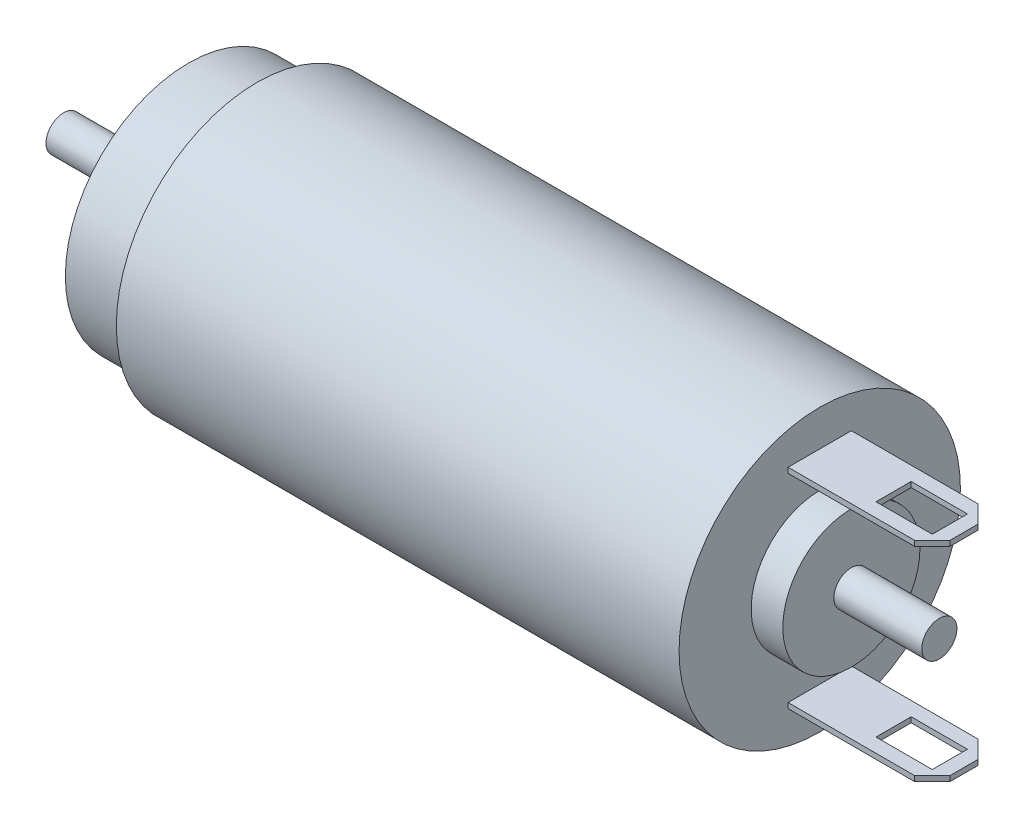
ISO-10303-21;
HEADER;
FILE_DESCRIPTION(('STEP AP214'),'2;1');
FILE_NAME('part.step','',(''),(''),'','','');
FILE_SCHEMA(('AUTOMOTIVE_DESIGN { 1 0 10303 214 1 1 1 1 }'));
ENDSEC;
DATA;
#1=APPLICATION_CONTEXT('core data for automotive mechanical design processes');
#2=APPLICATION_PROTOCOL_DEFINITION('international standard','automotive_design',2000,#1);
#3=PRODUCT_CONTEXT('',#1,'mechanical');
#4=PRODUCT('Part','Part','',(#3));
#5=PRODUCT_RELATED_PRODUCT_CATEGORY('part','',(#4));
#6=PRODUCT_DEFINITION_FORMATION('','',#4);
#7=PRODUCT_DEFINITION_CONTEXT('part definition',#1,'design');
#8=PRODUCT_DEFINITION('design','',#6,#7);
#9=PRODUCT_DEFINITION_SHAPE('','',#8);
#10=(LENGTH_UNIT() NAMED_UNIT(*) SI_UNIT(.MILLI.,.METRE.));
#11=(NAMED_UNIT(*) PLANE_ANGLE_UNIT() SI_UNIT($,.RADIAN.));
#12=(NAMED_UNIT(*) SI_UNIT($,.STERADIAN.) SOLID_ANGLE_UNIT());
#13=UNCERTAINTY_MEASURE_WITH_UNIT(LENGTH_MEASURE(1.E-05),#10,'distance_accuracy_value','');
#14=(GEOMETRIC_REPRESENTATION_CONTEXT(3) GLOBAL_UNCERTAINTY_ASSIGNED_CONTEXT((#13)) GLOBAL_UNIT_ASSIGNED_CONTEXT((#10,
#11,#12)) REPRESENTATION_CONTEXT('',''));
#15=CARTESIAN_POINT('',(0.,0.,0.));
#16=DIRECTION('',(0.,0.,1.));
#17=DIRECTION('',(1.,0.,0.));
#18=AXIS2_PLACEMENT_3D('',#15,#16,#17);
#19=CARTESIAN_POINT('',(0.,0.,0.));
#20=DIRECTION('',(1.,0.,0.));
#21=DIRECTION('',(0.,0.,-1.));
#22=AXIS2_PLACEMENT_3D('',#19,#20,#21);
#23=PLANE('',#22);
#24=CARTESIAN_POINT('',(0.,0.,0.));
#25=DIRECTION('',(1.,0.,0.));
#26=DIRECTION('',(0.,0.,-1.));
#27=AXIS2_PLACEMENT_3D('',#24,#25,#26);
#28=CIRCLE('',#27,1.95);
#29=CARTESIAN_POINT('',(0.,0.,-1.95));
#30=VERTEX_POINT('',#29);
#31=EDGE_CURVE('E349',#30,#30,#28,.T.);
#32=ORIENTED_EDGE('',*,*,#31,.F.);
#33=EDGE_LOOP('',(#32));
#34=FACE_BOUND('',#33,.T.);
#35=CARTESIAN_POINT('',(0.,0.,0.));
#36=DIRECTION('',(1.,0.,0.));
#37=DIRECTION('',(0.,0.,-1.));
#38=AXIS2_PLACEMENT_3D('',#35,#36,#37);
#39=CIRCLE('',#38,4.);
#40=CARTESIAN_POINT('',(0.,0.,-4.));
#41=VERTEX_POINT('',#40);
#42=EDGE_CURVE('E361',#41,#41,#39,.T.);
#43=ORIENTED_EDGE('',*,*,#42,.T.);
#44=EDGE_LOOP('',(#43));
#45=FACE_BOUND('',#44,.T.);
#46=DIRECTION('',(0.,0.,-1.));
#47=VECTOR('',#46,1.);
#48=CARTESIAN_POINT('',(0.,2.82169085468414,-0.899999999999999));
#49=LINE('',#48,#47);
#50=CARTESIAN_POINT('',(0.,2.82169085468414,0.900000000000001));
#51=VERTEX_POINT('',#50);
#52=CARTESIAN_POINT('',(0.,2.82169085468414,-0.899999999999999));
#53=VERTEX_POINT('',#52);
#54=EDGE_CURVE('E317',#51,#53,#49,.T.);
#55=ORIENTED_EDGE('',*,*,#54,.F.);
#56=DIRECTION('',(0.,-1.,0.));
#57=VECTOR('',#56,1.);
#58=CARTESIAN_POINT('',(0.,2.82169085468414,0.900000000000001));
#59=LINE('',#58,#57);
#60=CARTESIAN_POINT('',(0.,2.97169085468414,0.900000000000001));
#61=VERTEX_POINT('',#60);
#62=EDGE_CURVE('E303',#61,#51,#59,.T.);
#63=ORIENTED_EDGE('',*,*,#62,.F.);
#64=DIRECTION('',(0.,0.,1.));
#65=VECTOR('',#64,1.);
#66=CARTESIAN_POINT('',(0.,2.97169085468414,0.900000000000001));
#67=LINE('',#66,#65);
#68=CARTESIAN_POINT('',(0.,2.97169085468414,-0.899999999999999));
#69=VERTEX_POINT('',#68);
#70=EDGE_CURVE('E309',#69,#61,#67,.T.);
#71=ORIENTED_EDGE('',*,*,#70,.F.);
#72=DIRECTION('',(0.,1.,0.));
#73=VECTOR('',#72,1.);
#74=CARTESIAN_POINT('',(0.,2.97169085468414,-0.899999999999999));
#75=LINE('',#74,#73);
#76=EDGE_CURVE('E321',#53,#69,#75,.T.);
#77=ORIENTED_EDGE('',*,*,#76,.F.);
#78=EDGE_LOOP('',(#55,#63,#71,#77));
#79=FACE_BOUND('',#78,.T.);
#80=DIRECTION('',(0.,0.,1.));
#81=VECTOR('',#80,1.);
#82=CARTESIAN_POINT('',(0.,-2.82169085468414,0.899999999999999));
#83=LINE('',#82,#81);
#84=CARTESIAN_POINT('',(0.,-2.82169085468414,-0.900000000000001));
#85=VERTEX_POINT('',#84);
#86=CARTESIAN_POINT('',(0.,-2.82169085468414,0.899999999999999));
#87=VERTEX_POINT('',#86);
#88=EDGE_CURVE('E238',#85,#87,#83,.T.);
#89=ORIENTED_EDGE('',*,*,#88,.F.);
#90=DIRECTION('',(0.,1.,0.));
#91=VECTOR('',#90,1.);
#92=CARTESIAN_POINT('',(0.,-2.82169085468414,-0.900000000000001));
#93=LINE('',#92,#91);
#94=CARTESIAN_POINT('',(0.,-2.97169085468414,-0.900000000000001));
#95=VERTEX_POINT('',#94);
#96=EDGE_CURVE('E224',#95,#85,#93,.T.);
#97=ORIENTED_EDGE('',*,*,#96,.F.);
#98=DIRECTION('',(0.,0.,-1.));
#99=VECTOR('',#98,1.);
#100=CARTESIAN_POINT('',(0.,-2.97169085468414,-0.900000000000001));
#101=LINE('',#100,#99);
#102=CARTESIAN_POINT('',(0.,-2.97169085468414,0.899999999999999));
#103=VERTEX_POINT('',#102);
#104=EDGE_CURVE('E230',#103,#95,#101,.T.);
#105=ORIENTED_EDGE('',*,*,#104,.F.);
#106=DIRECTION('',(0.,-1.,0.));
#107=VECTOR('',#106,1.);
#108=CARTESIAN_POINT('',(0.,-2.97169085468414,0.899999999999999));
#109=LINE('',#108,#107);
#110=EDGE_CURVE('E242',#87,#103,#109,.T.);
#111=ORIENTED_EDGE('',*,*,#110,.F.);
#112=EDGE_LOOP('',(#89,#97,#105,#111));
#113=FACE_BOUND('',#112,.T.);
#114=ADVANCED_FACE('F47',(#34,#45,#79,#113),#23,.T.);
#115=CARTESIAN_POINT('',(-16.,0.,0.));
#116=DIRECTION('',(1.,0.,0.));
#117=DIRECTION('',(0.,0.,-1.));
#118=AXIS2_PLACEMENT_3D('',#115,#116,#117);
#119=CYLINDRICAL_SURFACE('',#118,4.);
#120=CARTESIAN_POINT('',(-16.,0.,0.));
#121=DIRECTION('',(1.,0.,0.));
#122=DIRECTION('',(0.,0.,-1.));
#123=AXIS2_PLACEMENT_3D('',#120,#121,#122);
#124=CIRCLE('',#123,4.);
#125=CARTESIAN_POINT('',(-16.,0.,-4.));
#126=VERTEX_POINT('',#125);
#127=EDGE_CURVE('E365',#126,#126,#124,.T.);
#128=ORIENTED_EDGE('',*,*,#127,.T.);
#129=EDGE_LOOP('',(#128));
#130=FACE_BOUND('',#129,.T.);
#131=ORIENTED_EDGE('',*,*,#42,.F.);
#132=EDGE_LOOP('',(#131));
#133=FACE_BOUND('',#132,.T.);
#134=ADVANCED_FACE('F459',(#130,#133),#119,.T.);
#135=CARTESIAN_POINT('',(-16.,0.,0.));
#136=DIRECTION('',(1.,0.,0.));
#137=DIRECTION('',(0.,0.,-1.));
#138=AXIS2_PLACEMENT_3D('',#135,#136,#137);
#139=PLANE('',#138);
#140=CARTESIAN_POINT('',(-16.,0.,0.));
#141=DIRECTION('',(-1.,0.,0.));
#142=DIRECTION('',(0.,0.,1.));
#143=AXIS2_PLACEMENT_3D('',#140,#141,#142);
#144=CIRCLE('',#143,3.5);
#145=CARTESIAN_POINT('',(-16.,0.,3.5));
#146=VERTEX_POINT('',#145);
#147=EDGE_CURVE('E357',#146,#146,#144,.T.);
#148=ORIENTED_EDGE('',*,*,#147,.F.);
#149=EDGE_LOOP('',(#148));
#150=FACE_BOUND('',#149,.T.);
#151=ORIENTED_EDGE('',*,*,#127,.F.);
#152=EDGE_LOOP('',(#151));
#153=FACE_BOUND('',#152,.T.);
#154=ADVANCED_FACE('F465',(#150,#153),#139,.F.);
#155=CARTESIAN_POINT('',(-17.95,0.,0.));
#156=DIRECTION('',(1.,0.,0.));
#157=DIRECTION('',(0.,0.,-1.));
#158=AXIS2_PLACEMENT_3D('',#155,#156,#157);
#159=CYLINDRICAL_SURFACE('',#158,3.5);
#160=CARTESIAN_POINT('',(-17.95,0.,0.));
#161=DIRECTION('',(-1.,0.,0.));
#162=DIRECTION('',(0.,0.,1.));
#163=AXIS2_PLACEMENT_3D('',#160,#161,#162);
#164=CIRCLE('',#163,3.5);
#165=CARTESIAN_POINT('',(-17.95,0.,3.5));
#166=VERTEX_POINT('',#165);
#167=EDGE_CURVE('E353',#166,#166,#164,.T.);
#168=ORIENTED_EDGE('',*,*,#167,.F.);
#169=EDGE_LOOP('',(#168));
#170=FACE_BOUND('',#169,.T.);
#171=ORIENTED_EDGE('',*,*,#147,.T.);
#172=EDGE_LOOP('',(#171));
#173=FACE_BOUND('',#172,.T.);
#174=ADVANCED_FACE('F642',(#170,#173),#159,.T.);
#175=CARTESIAN_POINT('',(-17.95,0.,0.));
#176=DIRECTION('',(-1.,0.,0.));
#177=DIRECTION('',(0.,0.,1.));
#178=AXIS2_PLACEMENT_3D('',#175,#176,#177);
#179=PLANE('',#178);
#180=CARTESIAN_POINT('',(-17.95,0.,0.));
#181=DIRECTION('',(-1.,0.,0.));
#182=DIRECTION('',(0.,0.,1.));
#183=AXIS2_PLACEMENT_3D('',#180,#181,#182);
#184=CIRCLE('',#183,1.55);
#185=CARTESIAN_POINT('',(-17.95,0.,1.55));
#186=VERTEX_POINT('',#185);
#187=EDGE_CURVE('E610',#186,#186,#184,.T.);
#188=ORIENTED_EDGE('',*,*,#187,.F.);
#189=EDGE_LOOP('',(#188));
#190=FACE_BOUND('',#189,.T.);
#191=ORIENTED_EDGE('',*,*,#167,.T.);
#192=EDGE_LOOP('',(#191));
#193=FACE_BOUND('',#192,.T.);
#194=ADVANCED_FACE('F639',(#190,#193),#179,.T.);
#195=CARTESIAN_POINT('',(0.9,0.,0.));
#196=DIRECTION('',(-1.,0.,0.));
#197=DIRECTION('',(0.,0.,1.));
#198=AXIS2_PLACEMENT_3D('',#195,#196,#197);
#199=CYLINDRICAL_SURFACE('',#198,1.95);
#200=CARTESIAN_POINT('',(0.9,0.,0.));
#201=DIRECTION('',(1.,0.,0.));
#202=DIRECTION('',(0.,0.,-1.));
#203=AXIS2_PLACEMENT_3D('',#200,#201,#202);
#204=CIRCLE('',#203,1.95);
#205=CARTESIAN_POINT('',(0.9,0.,-1.95));
#206=VERTEX_POINT('',#205);
#207=EDGE_CURVE('E343',#206,#206,#204,.T.);
#208=ORIENTED_EDGE('',*,*,#207,.F.);
#209=EDGE_LOOP('',(#208));
#210=FACE_BOUND('',#209,.T.);
#211=ORIENTED_EDGE('',*,*,#31,.T.);
#212=EDGE_LOOP('',(#211));
#213=FACE_BOUND('',#212,.T.);
#214=ADVANCED_FACE('F641',(#210,#213),#199,.T.);
#215=CARTESIAN_POINT('',(0.9,0.,0.));
#216=DIRECTION('',(1.,0.,0.));
#217=DIRECTION('',(0.,0.,-1.));
#218=AXIS2_PLACEMENT_3D('',#215,#216,#217);
#219=PLANE('',#218);
#220=CARTESIAN_POINT('',(0.9,0.,0.));
#221=DIRECTION('',(1.,0.,0.));
#222=DIRECTION('',(0.,0.,-1.));
#223=AXIS2_PLACEMENT_3D('',#220,#221,#222);
#224=CIRCLE('',#223,0.5);
#225=CARTESIAN_POINT('',(0.9,0.,-0.5));
#226=VERTEX_POINT('',#225);
#227=EDGE_CURVE('E344',#226,#226,#224,.T.);
#228=ORIENTED_EDGE('',*,*,#227,.F.);
#229=EDGE_LOOP('',(#228));
#230=FACE_BOUND('',#229,.T.);
#231=ORIENTED_EDGE('',*,*,#207,.T.);
#232=EDGE_LOOP('',(#231));
#233=FACE_BOUND('',#232,.T.);
#234=ADVANCED_FACE('F704',(#230,#233),#219,.T.);
#235=CARTESIAN_POINT('',(3.4,0.,0.));
#236=DIRECTION('',(-1.,0.,0.));
#237=DIRECTION('',(0.,0.,1.));
#238=AXIS2_PLACEMENT_3D('',#235,#236,#237);
#239=CYLINDRICAL_SURFACE('',#238,0.5);
#240=CARTESIAN_POINT('',(3.4,0.,0.));
#241=DIRECTION('',(1.,0.,0.));
#242=DIRECTION('',(0.,0.,-1.));
#243=AXIS2_PLACEMENT_3D('',#240,#241,#242);
#244=CIRCLE('',#243,0.5);
#245=CARTESIAN_POINT('',(3.4,0.,-0.5));
#246=VERTEX_POINT('',#245);
#247=EDGE_CURVE('E339',#246,#246,#244,.T.);
#248=ORIENTED_EDGE('',*,*,#247,.F.);
#249=EDGE_LOOP('',(#248));
#250=FACE_BOUND('',#249,.T.);
#251=ORIENTED_EDGE('',*,*,#227,.T.);
#252=EDGE_LOOP('',(#251));
#253=FACE_BOUND('',#252,.T.);
#254=ADVANCED_FACE('F700',(#250,#253),#239,.T.);
#255=CARTESIAN_POINT('',(3.4,0.,0.));
#256=DIRECTION('',(1.,0.,0.));
#257=DIRECTION('',(0.,0.,-1.));
#258=AXIS2_PLACEMENT_3D('',#255,#256,#257);
#259=PLANE('',#258);
#260=ORIENTED_EDGE('',*,*,#247,.T.);
#261=EDGE_LOOP('',(#260));
#262=FACE_BOUND('',#261,.T.);
#263=ADVANCED_FACE('F697',(#262),#259,.T.);
#264=CARTESIAN_POINT('',(4.1,2.82169085468414,0.900000000000001));
#265=DIRECTION('',(0.,0.,-1.));
#266=DIRECTION('',(-1.,0.,0.));
#267=AXIS2_PLACEMENT_3D('',#264,#265,#266);
#268=PLANE('',#267);
#269=DIRECTION('',(-1.,0.,0.));
#270=VECTOR('',#269,1.);
#271=CARTESIAN_POINT('',(4.1,2.82169085468414,0.900000000000001));
#272=LINE('',#271,#270);
#273=CARTESIAN_POINT('',(3.59999999999999,2.82169085468414,0.900000000000001));
#274=VERTEX_POINT('',#273);
#275=EDGE_CURVE('E336',#274,#51,#272,.T.);
#276=ORIENTED_EDGE('',*,*,#275,.F.);
#277=DIRECTION('',(0.,1.,0.));
#278=VECTOR('',#277,1.);
#279=CARTESIAN_POINT('',(3.59999999999999,2.82169085468414,0.900000000000001));
#280=LINE('',#279,#278);
#281=CARTESIAN_POINT('',(3.59999999999999,2.97169085468414,0.900000000000001));
#282=VERTEX_POINT('',#281);
#283=EDGE_CURVE('E394',#274,#282,#280,.T.);
#284=ORIENTED_EDGE('',*,*,#283,.T.);
#285=DIRECTION('',(-1.,0.,0.));
#286=VECTOR('',#285,1.);
#287=CARTESIAN_POINT('',(4.1,2.97169085468414,0.900000000000001));
#288=LINE('',#287,#286);
#289=EDGE_CURVE('E313',#282,#61,#288,.T.);
#290=ORIENTED_EDGE('',*,*,#289,.T.);
#291=ORIENTED_EDGE('',*,*,#62,.T.);
#292=EDGE_LOOP('',(#276,#284,#290,#291));
#293=FACE_BOUND('',#292,.T.);
#294=ADVANCED_FACE('F668',(#293),#268,.F.);
#295=CARTESIAN_POINT('',(4.1,2.82169085468414,-0.899999999999999));
#296=DIRECTION('',(0.,1.,0.));
#297=DIRECTION('',(0.,0.,1.));
#298=AXIS2_PLACEMENT_3D('',#295,#296,#297);
#299=PLANE('',#298);
#300=DIRECTION('',(1.,0.,0.));
#301=VECTOR('',#300,1.);
#302=CARTESIAN_POINT('',(2.1,2.82169085468414,-0.499999999999999));
#303=LINE('',#302,#301);
#304=CARTESIAN_POINT('',(2.1,2.82169085468414,-0.499999999999999));
#305=VERTEX_POINT('',#304);
#306=CARTESIAN_POINT('',(3.7,2.82169085468414,-0.499999999999999));
#307=VERTEX_POINT('',#306);
#308=EDGE_CURVE('E263',#305,#307,#303,.T.);
#309=ORIENTED_EDGE('',*,*,#308,.F.);
#310=DIRECTION('',(0.,0.,-1.));
#311=VECTOR('',#310,1.);
#312=CARTESIAN_POINT('',(2.1,2.82169085468414,-0.499999999999999));
#313=LINE('',#312,#311);
#314=CARTESIAN_POINT('',(2.1,2.82169085468414,0.499999999999999));
#315=VERTEX_POINT('',#314);
#316=EDGE_CURVE('E267',#315,#305,#313,.T.);
#317=ORIENTED_EDGE('',*,*,#316,.F.);
#318=DIRECTION('',(-1.,0.,0.));
#319=VECTOR('',#318,1.);
#320=CARTESIAN_POINT('',(2.1,2.82169085468414,0.499999999999999));
#321=LINE('',#320,#319);
#322=CARTESIAN_POINT('',(3.7,2.82169085468414,0.499999999999999));
#323=VERTEX_POINT('',#322);
#324=EDGE_CURVE('E290',#323,#315,#321,.T.);
#325=ORIENTED_EDGE('',*,*,#324,.F.);
#326=DIRECTION('',(0.,0.,1.));
#327=VECTOR('',#326,1.);
#328=CARTESIAN_POINT('',(3.7,2.82169085468414,-0.499999999999999));
#329=LINE('',#328,#327);
#330=EDGE_CURVE('E260',#307,#323,#329,.T.);
#331=ORIENTED_EDGE('',*,*,#330,.F.);
#332=EDGE_LOOP('',(#309,#317,#325,#331));
#333=FACE_BOUND('',#332,.T.);
#334=DIRECTION('',(-1.,0.,0.));
#335=VECTOR('',#334,1.);
#336=CARTESIAN_POINT('',(4.1,2.82169085468414,-0.899999999999999));
#337=LINE('',#336,#335);
#338=CARTESIAN_POINT('',(3.6,2.82169085468414,-0.899999999999999));
#339=VERTEX_POINT('',#338);
#340=EDGE_CURVE('E333',#339,#53,#337,.T.);
#341=ORIENTED_EDGE('',*,*,#340,.F.);
#342=DIRECTION('',(-0.707106781186548,0.,-0.707106781186548));
#343=VECTOR('',#342,1.);
#344=CARTESIAN_POINT('',(4.1,2.82169085468414,-0.399999999999999));
#345=LINE('',#344,#343);
#346=CARTESIAN_POINT('',(4.1,2.82169085468414,-0.399999999999999));
#347=VERTEX_POINT('',#346);
#348=EDGE_CURVE('E391',#339,#347,#345,.F.);
#349=ORIENTED_EDGE('',*,*,#348,.T.);
#350=DIRECTION('',(0.,0.,-1.));
#351=VECTOR('',#350,1.);
#352=CARTESIAN_POINT('',(4.1,2.82169085468414,-0.899999999999999));
#353=LINE('',#352,#351);
#354=CARTESIAN_POINT('',(4.1,2.82169085468414,0.399999999999997));
#355=VERTEX_POINT('',#354);
#356=EDGE_CURVE('E304',#355,#347,#353,.T.);
#357=ORIENTED_EDGE('',*,*,#356,.F.);
#358=DIRECTION('',(0.70710678118655,0.,-0.707106781186545));
#359=VECTOR('',#358,1.);
#360=CARTESIAN_POINT('',(4.1,2.82169085468414,0.399999999999997));
#361=LINE('',#360,#359);
#362=EDGE_CURVE('E388',#355,#274,#361,.F.);
#363=ORIENTED_EDGE('',*,*,#362,.T.);
#364=ORIENTED_EDGE('',*,*,#275,.T.);
#365=ORIENTED_EDGE('',*,*,#54,.T.);
#366=EDGE_LOOP('',(#341,#349,#357,#363,#364,#365));
#367=FACE_BOUND('',#366,.T.);
#368=ADVANCED_FACE('F662',(#333,#367),#299,.F.);
#369=CARTESIAN_POINT('',(4.1,2.97169085468414,-0.899999999999999));
#370=DIRECTION('',(0.,0.,1.));
#371=DIRECTION('',(1.,0.,0.));
#372=AXIS2_PLACEMENT_3D('',#369,#370,#371);
#373=PLANE('',#372);
#374=DIRECTION('',(-1.,0.,0.));
#375=VECTOR('',#374,1.);
#376=CARTESIAN_POINT('',(4.1,2.97169085468414,-0.899999999999999));
#377=LINE('',#376,#375);
#378=CARTESIAN_POINT('',(3.6,2.97169085468414,-0.899999999999999));
#379=VERTEX_POINT('',#378);
#380=EDGE_CURVE('E330',#379,#69,#377,.T.);
#381=ORIENTED_EDGE('',*,*,#380,.F.);
#382=DIRECTION('',(0.,-1.,0.));
#383=VECTOR('',#382,1.);
#384=CARTESIAN_POINT('',(3.6,2.97169085468414,-0.899999999999999));
#385=LINE('',#384,#383);
#386=EDGE_CURVE('E385',#379,#339,#385,.T.);
#387=ORIENTED_EDGE('',*,*,#386,.T.);
#388=ORIENTED_EDGE('',*,*,#340,.T.);
#389=ORIENTED_EDGE('',*,*,#76,.T.);
#390=EDGE_LOOP('',(#381,#387,#388,#389));
#391=FACE_BOUND('',#390,.T.);
#392=ADVANCED_FACE('F677',(#391),#373,.F.);
#393=CARTESIAN_POINT('',(4.1,2.97169085468414,0.900000000000001));
#394=DIRECTION('',(0.,-1.,0.));
#395=DIRECTION('',(0.,0.,-1.));
#396=AXIS2_PLACEMENT_3D('',#393,#394,#395);
#397=PLANE('',#396);
#398=DIRECTION('',(1.,0.,0.));
#399=VECTOR('',#398,1.);
#400=CARTESIAN_POINT('',(2.1,2.97169085468414,0.499999999999999));
#401=LINE('',#400,#399);
#402=CARTESIAN_POINT('',(2.1,2.97169085468414,0.499999999999999));
#403=VERTEX_POINT('',#402);
#404=CARTESIAN_POINT('',(3.7,2.97169085468414,0.499999999999999));
#405=VERTEX_POINT('',#404);
#406=EDGE_CURVE('E274',#403,#405,#401,.T.);
#407=ORIENTED_EDGE('',*,*,#406,.F.);
#408=DIRECTION('',(0.,0.,1.));
#409=VECTOR('',#408,1.);
#410=CARTESIAN_POINT('',(2.1,2.97169085468414,-0.499999999999999));
#411=LINE('',#410,#409);
#412=CARTESIAN_POINT('',(2.1,2.97169085468414,-0.499999999999999));
#413=VERTEX_POINT('',#412);
#414=EDGE_CURVE('E271',#413,#403,#411,.T.);
#415=ORIENTED_EDGE('',*,*,#414,.F.);
#416=DIRECTION('',(-1.,0.,0.));
#417=VECTOR('',#416,1.);
#418=CARTESIAN_POINT('',(2.1,2.97169085468414,-0.499999999999999));
#419=LINE('',#418,#417);
#420=CARTESIAN_POINT('',(3.7,2.97169085468414,-0.499999999999999));
#421=VERTEX_POINT('',#420);
#422=EDGE_CURVE('E282',#421,#413,#419,.T.);
#423=ORIENTED_EDGE('',*,*,#422,.F.);
#424=DIRECTION('',(0.,0.,-1.));
#425=VECTOR('',#424,1.);
#426=CARTESIAN_POINT('',(3.7,2.97169085468414,-0.499999999999999));
#427=LINE('',#426,#425);
#428=EDGE_CURVE('E278',#405,#421,#427,.T.);
#429=ORIENTED_EDGE('',*,*,#428,.F.);
#430=EDGE_LOOP('',(#407,#415,#423,#429));
#431=FACE_BOUND('',#430,.T.);
#432=DIRECTION('',(0.,0.,1.));
#433=VECTOR('',#432,1.);
#434=CARTESIAN_POINT('',(4.1,2.97169085468414,0.900000000000001));
#435=LINE('',#434,#433);
#436=CARTESIAN_POINT('',(4.1,2.97169085468414,-0.399999999999999));
#437=VERTEX_POINT('',#436);
#438=CARTESIAN_POINT('',(4.1,2.97169085468414,0.399999999999997));
#439=VERTEX_POINT('',#438);
#440=EDGE_CURVE('E308',#437,#439,#435,.T.);
#441=ORIENTED_EDGE('',*,*,#440,.F.);
#442=DIRECTION('',(0.707106781186548,0.,0.707106781186548));
#443=VECTOR('',#442,1.);
#444=CARTESIAN_POINT('',(4.1,2.97169085468414,-0.399999999999999));
#445=LINE('',#444,#443);
#446=EDGE_CURVE('E382',#437,#379,#445,.F.);
#447=ORIENTED_EDGE('',*,*,#446,.T.);
#448=ORIENTED_EDGE('',*,*,#380,.T.);
#449=ORIENTED_EDGE('',*,*,#70,.T.);
#450=ORIENTED_EDGE('',*,*,#289,.F.);
#451=DIRECTION('',(-0.70710678118655,0.,0.707106781186545));
#452=VECTOR('',#451,1.);
#453=CARTESIAN_POINT('',(4.1,2.97169085468414,0.399999999999997));
#454=LINE('',#453,#452);
#455=EDGE_CURVE('E379',#282,#439,#454,.F.);
#456=ORIENTED_EDGE('',*,*,#455,.T.);
#457=EDGE_LOOP('',(#441,#447,#448,#449,#450,#456));
#458=FACE_BOUND('',#457,.T.);
#459=ADVANCED_FACE('F673',(#431,#458),#397,.F.);
#460=CARTESIAN_POINT('',(4.1,0.,0.));
#461=DIRECTION('',(-1.,0.,0.));
#462=DIRECTION('',(0.,0.,1.));
#463=AXIS2_PLACEMENT_3D('',#460,#461,#462);
#464=PLANE('',#463);
#465=ORIENTED_EDGE('',*,*,#356,.T.);
#466=DIRECTION('',(0.,1.,0.));
#467=VECTOR('',#466,1.);
#468=CARTESIAN_POINT('',(4.1,0.,-0.399999999999999));
#469=LINE('',#468,#467);
#470=EDGE_CURVE('E375',#347,#437,#469,.T.);
#471=ORIENTED_EDGE('',*,*,#470,.T.);
#472=ORIENTED_EDGE('',*,*,#440,.T.);
#473=DIRECTION('',(0.,-1.,0.));
#474=VECTOR('',#473,1.);
#475=CARTESIAN_POINT('',(4.1,0.,0.399999999999997));
#476=LINE('',#475,#474);
#477=EDGE_CURVE('E348',#439,#355,#476,.T.);
#478=ORIENTED_EDGE('',*,*,#477,.T.);
#479=EDGE_LOOP('',(#465,#471,#472,#478));
#480=FACE_BOUND('',#479,.T.);
#481=ADVANCED_FACE('F481',(#480),#464,.F.);
#482=CARTESIAN_POINT('',(4.1,0.,-0.399999999999999));
#483=DIRECTION('',(-0.707106781186547,0.,0.707106781186547));
#484=DIRECTION('',(0.,1.,0.));
#485=AXIS2_PLACEMENT_3D('',#482,#483,#484);
#486=PLANE('',#485);
#487=ORIENTED_EDGE('',*,*,#348,.F.);
#488=ORIENTED_EDGE('',*,*,#386,.F.);
#489=ORIENTED_EDGE('',*,*,#446,.F.);
#490=ORIENTED_EDGE('',*,*,#470,.F.);
#491=EDGE_LOOP('',(#487,#488,#489,#490));
#492=FACE_BOUND('',#491,.T.);
#493=ADVANCED_FACE('F474',(#492),#486,.F.);
#494=CARTESIAN_POINT('',(4.1,0.,0.399999999999997));
#495=DIRECTION('',(-0.707106781186545,0.,-0.70710678118655));
#496=DIRECTION('',(0.,-1.,0.));
#497=AXIS2_PLACEMENT_3D('',#494,#495,#496);
#498=PLANE('',#497);
#499=ORIENTED_EDGE('',*,*,#455,.F.);
#500=ORIENTED_EDGE('',*,*,#283,.F.);
#501=ORIENTED_EDGE('',*,*,#362,.F.);
#502=ORIENTED_EDGE('',*,*,#477,.F.);
#503=EDGE_LOOP('',(#499,#500,#501,#502));
#504=FACE_BOUND('',#503,.T.);
#505=ADVANCED_FACE('F480',(#504),#498,.F.);
#506=CARTESIAN_POINT('',(2.1,-4.001,-0.499999999999999));
#507=DIRECTION('',(-1.,0.,0.));
#508=DIRECTION('',(0.,0.,1.));
#509=AXIS2_PLACEMENT_3D('',#506,#507,#508);
#510=PLANE('',#509);
#511=ORIENTED_EDGE('',*,*,#316,.T.);
#512=DIRECTION('',(0.,1.,0.));
#513=VECTOR('',#512,1.);
#514=CARTESIAN_POINT('',(2.1,-4.001,-0.499999999999999));
#515=LINE('',#514,#513);
#516=EDGE_CURVE('E287',#305,#413,#515,.T.);
#517=ORIENTED_EDGE('',*,*,#516,.T.);
#518=ORIENTED_EDGE('',*,*,#414,.T.);
#519=DIRECTION('',(0.,1.,0.));
#520=VECTOR('',#519,1.);
#521=CARTESIAN_POINT('',(2.1,-4.001,0.499999999999999));
#522=LINE('',#521,#520);
#523=EDGE_CURVE('E286',#315,#403,#522,.T.);
#524=ORIENTED_EDGE('',*,*,#523,.F.);
#525=EDGE_LOOP('',(#511,#517,#518,#524));
#526=FACE_BOUND('',#525,.T.);
#527=ADVANCED_FACE('F487',(#526),#510,.F.);
#528=CARTESIAN_POINT('',(2.1,-4.001,-0.499999999999999));
#529=DIRECTION('',(0.,0.,-1.));
#530=DIRECTION('',(-1.,0.,0.));
#531=AXIS2_PLACEMENT_3D('',#528,#529,#530);
#532=PLANE('',#531);
#533=ORIENTED_EDGE('',*,*,#308,.T.);
#534=DIRECTION('',(0.,1.,0.));
#535=VECTOR('',#534,1.);
#536=CARTESIAN_POINT('',(3.7,-4.001,-0.499999999999999));
#537=LINE('',#536,#535);
#538=EDGE_CURVE('E291',#307,#421,#537,.T.);
#539=ORIENTED_EDGE('',*,*,#538,.T.);
#540=ORIENTED_EDGE('',*,*,#422,.T.);
#541=ORIENTED_EDGE('',*,*,#516,.F.);
#542=EDGE_LOOP('',(#533,#539,#540,#541));
#543=FACE_BOUND('',#542,.T.);
#544=ADVANCED_FACE('F780',(#543),#532,.F.);
#545=CARTESIAN_POINT('',(3.7,-4.001,-0.499999999999999));
#546=DIRECTION('',(1.,0.,0.));
#547=DIRECTION('',(0.,0.,-1.));
#548=AXIS2_PLACEMENT_3D('',#545,#546,#547);
#549=PLANE('',#548);
#550=ORIENTED_EDGE('',*,*,#330,.T.);
#551=DIRECTION('',(0.,1.,0.));
#552=VECTOR('',#551,1.);
#553=CARTESIAN_POINT('',(3.7,-4.001,0.499999999999999));
#554=LINE('',#553,#552);
#555=EDGE_CURVE('E294',#323,#405,#554,.T.);
#556=ORIENTED_EDGE('',*,*,#555,.T.);
#557=ORIENTED_EDGE('',*,*,#428,.T.);
#558=ORIENTED_EDGE('',*,*,#538,.F.);
#559=EDGE_LOOP('',(#550,#556,#557,#558));
#560=FACE_BOUND('',#559,.T.);
#561=ADVANCED_FACE('F455',(#560),#549,.F.);
#562=CARTESIAN_POINT('',(2.1,-4.001,0.499999999999999));
#563=DIRECTION('',(0.,0.,1.));
#564=DIRECTION('',(1.,0.,0.));
#565=AXIS2_PLACEMENT_3D('',#562,#563,#564);
#566=PLANE('',#565);
#567=ORIENTED_EDGE('',*,*,#324,.T.);
#568=ORIENTED_EDGE('',*,*,#523,.T.);
#569=ORIENTED_EDGE('',*,*,#406,.T.);
#570=ORIENTED_EDGE('',*,*,#555,.F.);
#571=EDGE_LOOP('',(#567,#568,#569,#570));
#572=FACE_BOUND('',#571,.T.);
#573=ADVANCED_FACE('F446',(#572),#566,.F.);
#574=CARTESIAN_POINT('',(4.1,-2.82169085468414,-0.900000000000001));
#575=DIRECTION('',(0.,0.,1.));
#576=DIRECTION('',(1.,0.,0.));
#577=AXIS2_PLACEMENT_3D('',#574,#575,#576);
#578=PLANE('',#577);
#579=DIRECTION('',(-1.,0.,0.));
#580=VECTOR('',#579,1.);
#581=CARTESIAN_POINT('',(4.1,-2.82169085468414,-0.900000000000001));
#582=LINE('',#581,#580);
#583=CARTESIAN_POINT('',(3.59999999999999,-2.82169085468414,-0.900000000000001));
#584=VERTEX_POINT('',#583);
#585=EDGE_CURVE('E257',#584,#85,#582,.T.);
#586=ORIENTED_EDGE('',*,*,#585,.F.);
#587=DIRECTION('',(0.,-1.,0.));
#588=VECTOR('',#587,1.);
#589=CARTESIAN_POINT('',(3.59999999999999,-2.82169085468414,-0.900000000000001));
#590=LINE('',#589,#588);
#591=CARTESIAN_POINT('',(3.59999999999999,-2.97169085468414,-0.900000000000001));
#592=VERTEX_POINT('',#591);
#593=EDGE_CURVE('E11',#584,#592,#590,.T.);
#594=ORIENTED_EDGE('',*,*,#593,.T.);
#595=DIRECTION('',(-1.,0.,0.));
#596=VECTOR('',#595,1.);
#597=CARTESIAN_POINT('',(4.1,-2.97169085468414,-0.900000000000001));
#598=LINE('',#597,#596);
#599=EDGE_CURVE('E234',#592,#95,#598,.T.);
#600=ORIENTED_EDGE('',*,*,#599,.T.);
#601=ORIENTED_EDGE('',*,*,#96,.T.);
#602=EDGE_LOOP('',(#586,#594,#600,#601));
#603=FACE_BOUND('',#602,.T.);
#604=ADVANCED_FACE('F444',(#603),#578,.F.);
#605=CARTESIAN_POINT('',(4.1,-2.82169085468414,0.899999999999999));
#606=DIRECTION('',(0.,-1.,0.));
#607=DIRECTION('',(0.,0.,-1.));
#608=AXIS2_PLACEMENT_3D('',#605,#606,#607);
#609=PLANE('',#608);
#610=DIRECTION('',(0.,0.,1.));
#611=VECTOR('',#610,1.);
#612=CARTESIAN_POINT('',(2.1,-2.82169085468414,0.499999999999999));
#613=LINE('',#612,#611);
#614=CARTESIAN_POINT('',(2.1,-2.82169085468414,-0.499999999999999));
#615=VERTEX_POINT('',#614);
#616=CARTESIAN_POINT('',(2.1,-2.82169085468414,0.499999999999999));
#617=VERTEX_POINT('',#616);
#618=EDGE_CURVE('E201',#615,#617,#613,.T.);
#619=ORIENTED_EDGE('',*,*,#618,.F.);
#620=DIRECTION('',(-1.,0.,0.));
#621=VECTOR('',#620,1.);
#622=CARTESIAN_POINT('',(2.1,-2.82169085468414,-0.499999999999999));
#623=LINE('',#622,#621);
#624=CARTESIAN_POINT('',(3.7,-2.82169085468414,-0.499999999999999));
#625=VERTEX_POINT('',#624);
#626=EDGE_CURVE('E64',#625,#615,#623,.T.);
#627=ORIENTED_EDGE('',*,*,#626,.F.);
#628=DIRECTION('',(0.,0.,-1.));
#629=VECTOR('',#628,1.);
#630=CARTESIAN_POINT('',(3.7,-2.82169085468414,0.499999999999999));
#631=LINE('',#630,#629);
#632=CARTESIAN_POINT('',(3.7,-2.82169085468414,0.499999999999999));
#633=VERTEX_POINT('',#632);
#634=EDGE_CURVE('E623',#633,#625,#631,.T.);
#635=ORIENTED_EDGE('',*,*,#634,.F.);
#636=DIRECTION('',(1.,0.,0.));
#637=VECTOR('',#636,1.);
#638=CARTESIAN_POINT('',(2.1,-2.82169085468414,0.499999999999999));
#639=LINE('',#638,#637);
#640=EDGE_CURVE('E628',#617,#633,#639,.T.);
#641=ORIENTED_EDGE('',*,*,#640,.F.);
#642=EDGE_LOOP('',(#619,#627,#635,#641));
#643=FACE_BOUND('',#642,.T.);
#644=DIRECTION('',(-1.,0.,0.));
#645=VECTOR('',#644,1.);
#646=CARTESIAN_POINT('',(4.1,-2.82169085468414,0.899999999999999));
#647=LINE('',#646,#645);
#648=CARTESIAN_POINT('',(3.6,-2.82169085468414,0.899999999999999));
#649=VERTEX_POINT('',#648);
#650=EDGE_CURVE('E254',#649,#87,#647,.T.);
#651=ORIENTED_EDGE('',*,*,#650,.F.);
#652=DIRECTION('',(-0.707106781186548,0.,0.707106781186548));
#653=VECTOR('',#652,1.);
#654=CARTESIAN_POINT('',(4.1,-2.82169085468414,0.399999999999999));
#655=LINE('',#654,#653);
#656=CARTESIAN_POINT('',(4.1,-2.82169085468414,0.399999999999999));
#657=VERTEX_POINT('',#656);
#658=EDGE_CURVE('E57',#649,#657,#655,.F.);
#659=ORIENTED_EDGE('',*,*,#658,.T.);
#660=DIRECTION('',(0.,0.,1.));
#661=VECTOR('',#660,1.);
#662=CARTESIAN_POINT('',(4.1,-2.82169085468414,0.899999999999999));
#663=LINE('',#662,#661);
#664=CARTESIAN_POINT('',(4.1,-2.82169085468414,-0.399999999999997));
#665=VERTEX_POINT('',#664);
#666=EDGE_CURVE('E225',#665,#657,#663,.T.);
#667=ORIENTED_EDGE('',*,*,#666,.F.);
#668=DIRECTION('',(0.70710678118655,0.,0.707106781186545));
#669=VECTOR('',#668,1.);
#670=CARTESIAN_POINT('',(4.1,-2.82169085468414,-0.399999999999997));
#671=LINE('',#670,#669);
#672=EDGE_CURVE('E414',#665,#584,#671,.F.);
#673=ORIENTED_EDGE('',*,*,#672,.T.);
#674=ORIENTED_EDGE('',*,*,#585,.T.);
#675=ORIENTED_EDGE('',*,*,#88,.T.);
#676=EDGE_LOOP('',(#651,#659,#667,#673,#674,#675));
#677=FACE_BOUND('',#676,.T.);
#678=ADVANCED_FACE('F421',(#643,#677),#609,.F.);
#679=CARTESIAN_POINT('',(4.1,-2.97169085468414,0.899999999999999));
#680=DIRECTION('',(0.,0.,-1.));
#681=DIRECTION('',(-1.,0.,0.));
#682=AXIS2_PLACEMENT_3D('',#679,#680,#681);
#683=PLANE('',#682);
#684=DIRECTION('',(-1.,0.,0.));
#685=VECTOR('',#684,1.);
#686=CARTESIAN_POINT('',(4.1,-2.97169085468414,0.899999999999999));
#687=LINE('',#686,#685);
#688=CARTESIAN_POINT('',(3.6,-2.97169085468414,0.899999999999999));
#689=VERTEX_POINT('',#688);
#690=EDGE_CURVE('E251',#689,#103,#687,.T.);
#691=ORIENTED_EDGE('',*,*,#690,.F.);
#692=DIRECTION('',(0.,1.,0.));
#693=VECTOR('',#692,1.);
#694=CARTESIAN_POINT('',(3.6,-2.97169085468414,0.899999999999999));
#695=LINE('',#694,#693);
#696=EDGE_CURVE('E411',#689,#649,#695,.T.);
#697=ORIENTED_EDGE('',*,*,#696,.T.);
#698=ORIENTED_EDGE('',*,*,#650,.T.);
#699=ORIENTED_EDGE('',*,*,#110,.T.);
#700=EDGE_LOOP('',(#691,#697,#698,#699));
#701=FACE_BOUND('',#700,.T.);
#702=ADVANCED_FACE('F432',(#701),#683,.F.);
#703=CARTESIAN_POINT('',(4.1,-2.97169085468414,-0.900000000000001));
#704=DIRECTION('',(0.,1.,0.));
#705=DIRECTION('',(0.,0.,1.));
#706=AXIS2_PLACEMENT_3D('',#703,#704,#705);
#707=PLANE('',#706);
#708=DIRECTION('',(0.,0.,1.));
#709=VECTOR('',#708,1.);
#710=CARTESIAN_POINT('',(3.7,-2.97169085468414,0.499999999999999));
#711=LINE('',#710,#709);
#712=CARTESIAN_POINT('',(3.7,-2.97169085468414,-0.499999999999999));
#713=VERTEX_POINT('',#712);
#714=CARTESIAN_POINT('',(3.7,-2.97169085468414,0.499999999999999));
#715=VERTEX_POINT('',#714);
#716=EDGE_CURVE('E206',#713,#715,#711,.T.);
#717=ORIENTED_EDGE('',*,*,#716,.F.);
#718=DIRECTION('',(1.,0.,0.));
#719=VECTOR('',#718,1.);
#720=CARTESIAN_POINT('',(2.1,-2.97169085468414,-0.499999999999999));
#721=LINE('',#720,#719);
#722=CARTESIAN_POINT('',(2.1,-2.97169085468414,-0.499999999999999));
#723=VERTEX_POINT('',#722);
#724=EDGE_CURVE('E187',#723,#713,#721,.T.);
#725=ORIENTED_EDGE('',*,*,#724,.F.);
#726=DIRECTION('',(0.,0.,-1.));
#727=VECTOR('',#726,1.);
#728=CARTESIAN_POINT('',(2.1,-2.97169085468414,0.499999999999999));
#729=LINE('',#728,#727);
#730=CARTESIAN_POINT('',(2.1,-2.97169085468414,0.499999999999999));
#731=VERTEX_POINT('',#730);
#732=EDGE_CURVE('E196',#731,#723,#729,.T.);
#733=ORIENTED_EDGE('',*,*,#732,.F.);
#734=DIRECTION('',(-1.,0.,0.));
#735=VECTOR('',#734,1.);
#736=CARTESIAN_POINT('',(2.1,-2.97169085468414,0.499999999999999));
#737=LINE('',#736,#735);
#738=EDGE_CURVE('E72',#715,#731,#737,.T.);
#739=ORIENTED_EDGE('',*,*,#738,.F.);
#740=EDGE_LOOP('',(#717,#725,#733,#739));
#741=FACE_BOUND('',#740,.T.);
#742=DIRECTION('',(0.,0.,-1.));
#743=VECTOR('',#742,1.);
#744=CARTESIAN_POINT('',(4.1,-2.97169085468414,-0.900000000000001));
#745=LINE('',#744,#743);
#746=CARTESIAN_POINT('',(4.1,-2.97169085468414,0.399999999999999));
#747=VERTEX_POINT('',#746);
#748=CARTESIAN_POINT('',(4.1,-2.97169085468414,-0.399999999999997));
#749=VERTEX_POINT('',#748);
#750=EDGE_CURVE('E229',#747,#749,#745,.T.);
#751=ORIENTED_EDGE('',*,*,#750,.F.);
#752=DIRECTION('',(0.707106781186548,0.,-0.707106781186548));
#753=VECTOR('',#752,1.);
#754=CARTESIAN_POINT('',(4.1,-2.97169085468414,0.399999999999999));
#755=LINE('',#754,#753);
#756=EDGE_CURVE('E408',#747,#689,#755,.F.);
#757=ORIENTED_EDGE('',*,*,#756,.T.);
#758=ORIENTED_EDGE('',*,*,#690,.T.);
#759=ORIENTED_EDGE('',*,*,#104,.T.);
#760=ORIENTED_EDGE('',*,*,#599,.F.);
#761=DIRECTION('',(-0.70710678118655,0.,-0.707106781186545));
#762=VECTOR('',#761,1.);
#763=CARTESIAN_POINT('',(4.1,-2.97169085468414,-0.399999999999997));
#764=LINE('',#763,#762);
#765=EDGE_CURVE('E405',#592,#749,#764,.F.);
#766=ORIENTED_EDGE('',*,*,#765,.T.);
#767=EDGE_LOOP('',(#751,#757,#758,#759,#760,#766));
#768=FACE_BOUND('',#767,.T.);
#769=ADVANCED_FACE('F203',(#741,#768),#707,.F.);
#770=CARTESIAN_POINT('',(4.1,0.,0.));
#771=DIRECTION('',(-1.,0.,0.));
#772=DIRECTION('',(0.,0.,-1.));
#773=AXIS2_PLACEMENT_3D('',#770,#771,#772);
#774=PLANE('',#773);
#775=ORIENTED_EDGE('',*,*,#666,.T.);
#776=DIRECTION('',(0.,-1.,0.));
#777=VECTOR('',#776,1.);
#778=CARTESIAN_POINT('',(4.1,0.,0.399999999999999));
#779=LINE('',#778,#777);
#780=EDGE_CURVE('E401',#657,#747,#779,.T.);
#781=ORIENTED_EDGE('',*,*,#780,.T.);
#782=ORIENTED_EDGE('',*,*,#750,.T.);
#783=DIRECTION('',(0.,1.,0.));
#784=VECTOR('',#783,1.);
#785=CARTESIAN_POINT('',(4.1,0.,-0.399999999999997));
#786=LINE('',#785,#784);
#787=EDGE_CURVE('E397',#749,#665,#786,.T.);
#788=ORIENTED_EDGE('',*,*,#787,.T.);
#789=EDGE_LOOP('',(#775,#781,#782,#788));
#790=FACE_BOUND('',#789,.T.);
#791=ADVANCED_FACE('F426',(#790),#774,.F.);
#792=CARTESIAN_POINT('',(4.1,0.,0.399999999999999));
#793=DIRECTION('',(-0.707106781186547,0.,-0.707106781186547));
#794=DIRECTION('',(0.,-1.,0.));
#795=AXIS2_PLACEMENT_3D('',#792,#793,#794);
#796=PLANE('',#795);
#797=ORIENTED_EDGE('',*,*,#658,.F.);
#798=ORIENTED_EDGE('',*,*,#696,.F.);
#799=ORIENTED_EDGE('',*,*,#756,.F.);
#800=ORIENTED_EDGE('',*,*,#780,.F.);
#801=EDGE_LOOP('',(#797,#798,#799,#800));
#802=FACE_BOUND('',#801,.T.);
#803=ADVANCED_FACE('F429',(#802),#796,.F.);
#804=CARTESIAN_POINT('',(4.1,0.,-0.399999999999997));
#805=DIRECTION('',(-0.707106781186545,0.,0.70710678118655));
#806=DIRECTION('',(0.,1.,0.));
#807=AXIS2_PLACEMENT_3D('',#804,#805,#806);
#808=PLANE('',#807);
#809=ORIENTED_EDGE('',*,*,#765,.F.);
#810=ORIENTED_EDGE('',*,*,#593,.F.);
#811=ORIENTED_EDGE('',*,*,#672,.F.);
#812=ORIENTED_EDGE('',*,*,#787,.F.);
#813=EDGE_LOOP('',(#809,#810,#811,#812));
#814=FACE_BOUND('',#813,.T.);
#815=ADVANCED_FACE('F50',(#814),#808,.F.);
#816=CARTESIAN_POINT('',(2.1,4.001,-0.499999999999999));
#817=DIRECTION('',(0.,0.,-1.));
#818=DIRECTION('',(-1.,0.,0.));
#819=AXIS2_PLACEMENT_3D('',#816,#817,#818);
#820=PLANE('',#819);
#821=ORIENTED_EDGE('',*,*,#626,.T.);
#822=DIRECTION('',(0.,-1.,0.));
#823=VECTOR('',#822,1.);
#824=CARTESIAN_POINT('',(2.1,4.001,-0.499999999999999));
#825=LINE('',#824,#823);
#826=EDGE_CURVE('E183',#615,#723,#825,.T.);
#827=ORIENTED_EDGE('',*,*,#826,.T.);
#828=ORIENTED_EDGE('',*,*,#724,.T.);
#829=DIRECTION('',(0.,-1.,0.));
#830=VECTOR('',#829,1.);
#831=CARTESIAN_POINT('',(3.7,4.001,-0.499999999999999));
#832=LINE('',#831,#830);
#833=EDGE_CURVE('E193',#625,#713,#832,.T.);
#834=ORIENTED_EDGE('',*,*,#833,.F.);
#835=EDGE_LOOP('',(#821,#827,#828,#834));
#836=FACE_BOUND('',#835,.T.);
#837=ADVANCED_FACE('F185',(#836),#820,.F.);
#838=CARTESIAN_POINT('',(3.7,4.001,0.499999999999999));
#839=DIRECTION('',(1.,0.,0.));
#840=DIRECTION('',(0.,0.,-1.));
#841=AXIS2_PLACEMENT_3D('',#838,#839,#840);
#842=PLANE('',#841);
#843=ORIENTED_EDGE('',*,*,#634,.T.);
#844=ORIENTED_EDGE('',*,*,#833,.T.);
#845=ORIENTED_EDGE('',*,*,#716,.T.);
#846=DIRECTION('',(0.,-1.,0.));
#847=VECTOR('',#846,1.);
#848=CARTESIAN_POINT('',(3.7,4.001,0.499999999999999));
#849=LINE('',#848,#847);
#850=EDGE_CURVE('E217',#633,#715,#849,.T.);
#851=ORIENTED_EDGE('',*,*,#850,.F.);
#852=EDGE_LOOP('',(#843,#844,#845,#851));
#853=FACE_BOUND('',#852,.T.);
#854=ADVANCED_FACE('F538',(#853),#842,.F.);
#855=CARTESIAN_POINT('',(2.1,4.001,0.499999999999999));
#856=DIRECTION('',(0.,0.,1.));
#857=DIRECTION('',(1.,0.,0.));
#858=AXIS2_PLACEMENT_3D('',#855,#856,#857);
#859=PLANE('',#858);
#860=ORIENTED_EDGE('',*,*,#640,.T.);
#861=ORIENTED_EDGE('',*,*,#850,.T.);
#862=ORIENTED_EDGE('',*,*,#738,.T.);
#863=DIRECTION('',(0.,-1.,0.));
#864=VECTOR('',#863,1.);
#865=CARTESIAN_POINT('',(2.1,4.001,0.499999999999999));
#866=LINE('',#865,#864);
#867=EDGE_CURVE('E198',#617,#731,#866,.T.);
#868=ORIENTED_EDGE('',*,*,#867,.F.);
#869=EDGE_LOOP('',(#860,#861,#862,#868));
#870=FACE_BOUND('',#869,.T.);
#871=ADVANCED_FACE('F546',(#870),#859,.F.);
#872=CARTESIAN_POINT('',(2.1,4.001,0.499999999999999));
#873=DIRECTION('',(-1.,0.,0.));
#874=DIRECTION('',(0.,0.,1.));
#875=AXIS2_PLACEMENT_3D('',#872,#873,#874);
#876=PLANE('',#875);
#877=ORIENTED_EDGE('',*,*,#618,.T.);
#878=ORIENTED_EDGE('',*,*,#867,.T.);
#879=ORIENTED_EDGE('',*,*,#732,.T.);
#880=ORIENTED_EDGE('',*,*,#826,.F.);
#881=EDGE_LOOP('',(#877,#878,#879,#880));
#882=FACE_BOUND('',#881,.T.);
#883=ADVANCED_FACE('F197',(#882),#876,.F.);
#884=CARTESIAN_POINT('',(-17.3,0.,0.));
#885=DIRECTION('',(-1.,0.,0.));
#886=DIRECTION('',(0.,0.,1.));
#887=AXIS2_PLACEMENT_3D('',#884,#885,#886);
#888=CYLINDRICAL_SURFACE('',#887,1.55);
#889=CARTESIAN_POINT('',(-17.3,0.,0.));
#890=DIRECTION('',(-1.,0.,0.));
#891=DIRECTION('',(0.,0.,1.));
#892=AXIS2_PLACEMENT_3D('',#889,#890,#891);
#893=CIRCLE('',#892,1.55);
#894=CARTESIAN_POINT('',(-17.3,0.,1.55));
#895=VERTEX_POINT('',#894);
#896=EDGE_CURVE('E616',#895,#895,#893,.T.);
#897=ORIENTED_EDGE('',*,*,#896,.F.);
#898=EDGE_LOOP('',(#897));
#899=FACE_BOUND('',#898,.T.);
#900=ORIENTED_EDGE('',*,*,#187,.T.);
#901=EDGE_LOOP('',(#900));
#902=FACE_BOUND('',#901,.T.);
#903=ADVANCED_FACE('F564',(#899,#902),#888,.F.);
#904=CARTESIAN_POINT('',(-17.3,0.,0.));
#905=DIRECTION('',(-1.,0.,0.));
#906=DIRECTION('',(0.,0.,1.));
#907=AXIS2_PLACEMENT_3D('',#904,#905,#906);
#908=PLANE('',#907);
#909=CARTESIAN_POINT('',(-17.3,0.,0.));
#910=DIRECTION('',(-1.,0.,0.));
#911=DIRECTION('',(0.,0.,1.));
#912=AXIS2_PLACEMENT_3D('',#909,#910,#911);
#913=CIRCLE('',#912,0.5);
#914=CARTESIAN_POINT('',(-17.3,0.,0.5));
#915=VERTEX_POINT('',#914);
#916=EDGE_CURVE('E611',#915,#915,#913,.T.);
#917=ORIENTED_EDGE('',*,*,#916,.F.);
#918=EDGE_LOOP('',(#917));
#919=FACE_BOUND('',#918,.T.);
#920=ORIENTED_EDGE('',*,*,#896,.T.);
#921=EDGE_LOOP('',(#920));
#922=FACE_BOUND('',#921,.T.);
#923=ADVANCED_FACE('F573',(#919,#922),#908,.T.);
#924=CARTESIAN_POINT('',(-21.5,0.,0.));
#925=DIRECTION('',(1.,0.,0.));
#926=DIRECTION('',(0.,0.,-1.));
#927=AXIS2_PLACEMENT_3D('',#924,#925,#926);
#928=CYLINDRICAL_SURFACE('',#927,0.5);
#929=CARTESIAN_POINT('',(-21.5,0.,0.));
#930=DIRECTION('',(-1.,0.,0.));
#931=DIRECTION('',(0.,0.,1.));
#932=AXIS2_PLACEMENT_3D('',#929,#930,#931);
#933=CIRCLE('',#932,0.5);
#934=CARTESIAN_POINT('',(-21.5,0.,0.5));
#935=VERTEX_POINT('',#934);
#936=EDGE_CURVE('E608',#935,#935,#933,.T.);
#937=ORIENTED_EDGE('',*,*,#936,.F.);
#938=EDGE_LOOP('',(#937));
#939=FACE_BOUND('',#938,.T.);
#940=ORIENTED_EDGE('',*,*,#916,.T.);
#941=EDGE_LOOP('',(#940));
#942=FACE_BOUND('',#941,.T.);
#943=ADVANCED_FACE('F583',(#939,#942),#928,.T.);
#944=CARTESIAN_POINT('',(-21.5,0.,0.));
#945=DIRECTION('',(-1.,0.,0.));
#946=DIRECTION('',(0.,0.,1.));
#947=AXIS2_PLACEMENT_3D('',#944,#945,#946);
#948=PLANE('',#947);
#949=ORIENTED_EDGE('',*,*,#936,.T.);
#950=EDGE_LOOP('',(#949));
#951=FACE_BOUND('',#950,.T.);
#952=ADVANCED_FACE('F593',(#951),#948,.T.);
#953=CLOSED_SHELL('',(#114,#134,#154,#174,#194,#214,#234,#254,#263,#294,#368,#392,#459,#481,
#493,#505,#527,#544,#561,#573,#604,#678,#702,#769,#791,#803,#815,#837,#854,#871,#883,#903,#923,
#943,#952));
#954=MANIFOLD_SOLID_BREP('B2',#953);
#955=ADVANCED_BREP_SHAPE_REPRESENTATION('',(#18,#954),#14);
#956=SHAPE_DEFINITION_REPRESENTATION(#9,#955);
ENDSEC;
END-ISO-10303-21;
